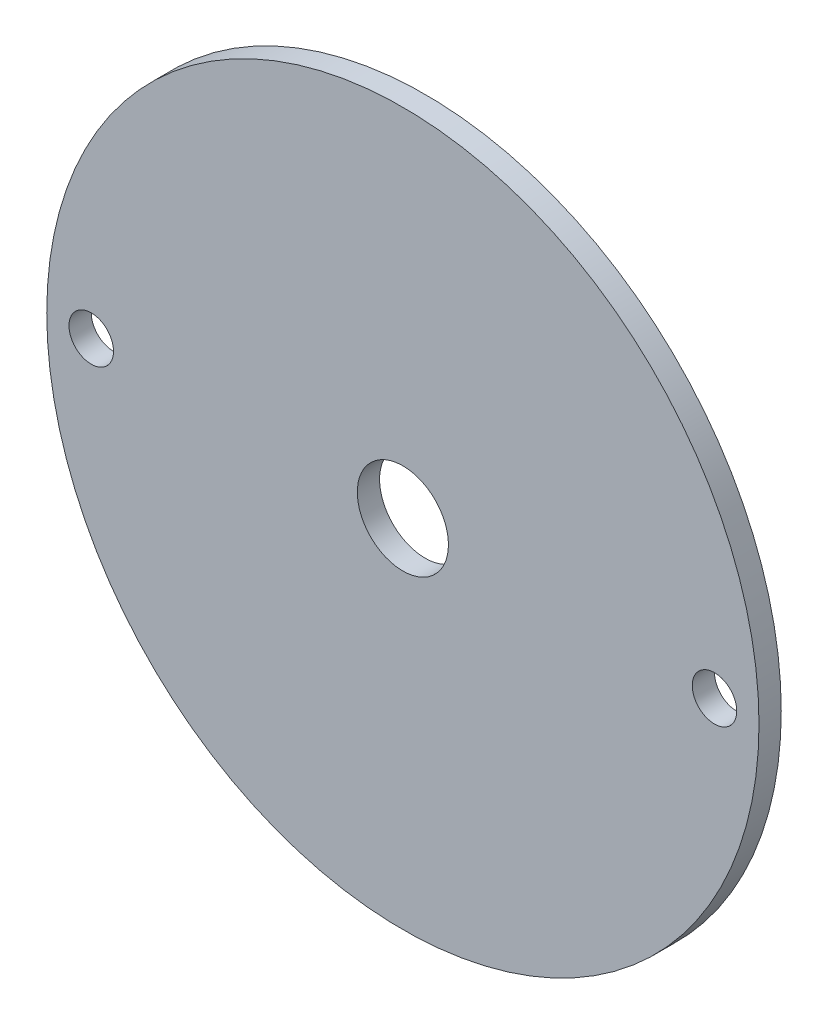
ISO-10303-21;
HEADER;
FILE_DESCRIPTION(('STEP AP214'),'2;1');
FILE_NAME('part.step','',(''),(''),'','','');
FILE_SCHEMA(('AUTOMOTIVE_DESIGN { 1 0 10303 214 1 1 1 1 }'));
ENDSEC;
DATA;
#1=APPLICATION_CONTEXT('core data for automotive mechanical design processes');
#2=APPLICATION_PROTOCOL_DEFINITION('international standard','automotive_design',2000,#1);
#3=PRODUCT_CONTEXT('',#1,'mechanical');
#4=PRODUCT('Part','Part','',(#3));
#5=PRODUCT_RELATED_PRODUCT_CATEGORY('part','',(#4));
#6=PRODUCT_DEFINITION_FORMATION('','',#4);
#7=PRODUCT_DEFINITION_CONTEXT('part definition',#1,'design');
#8=PRODUCT_DEFINITION('design','',#6,#7);
#9=PRODUCT_DEFINITION_SHAPE('','',#8);
#10=(LENGTH_UNIT() NAMED_UNIT(*) SI_UNIT(.MILLI.,.METRE.));
#11=(NAMED_UNIT(*) PLANE_ANGLE_UNIT() SI_UNIT($,.RADIAN.));
#12=(NAMED_UNIT(*) SI_UNIT($,.STERADIAN.) SOLID_ANGLE_UNIT());
#13=UNCERTAINTY_MEASURE_WITH_UNIT(LENGTH_MEASURE(1.E-05),#10,'distance_accuracy_value','');
#14=(GEOMETRIC_REPRESENTATION_CONTEXT(3) GLOBAL_UNCERTAINTY_ASSIGNED_CONTEXT((#13)) GLOBAL_UNIT_ASSIGNED_CONTEXT((#10,
#11,#12)) REPRESENTATION_CONTEXT('',''));
#15=CARTESIAN_POINT('',(0.,0.,0.));
#16=DIRECTION('',(0.,0.,1.));
#17=DIRECTION('',(1.,0.,0.));
#18=AXIS2_PLACEMENT_3D('',#15,#16,#17);
#19=CARTESIAN_POINT('',(0.,0.,3.175));
#20=DIRECTION('',(0.,0.,1.));
#21=DIRECTION('',(1.,0.,0.));
#22=AXIS2_PLACEMENT_3D('',#19,#20,#21);
#23=PLANE('',#22);
#24=CARTESIAN_POINT('',(-44.45,0.,3.175));
#25=DIRECTION('',(0.,0.,1.));
#26=DIRECTION('',(1.,0.,0.));
#27=AXIS2_PLACEMENT_3D('',#24,#25,#26);
#28=CIRCLE('',#27,3.175);
#29=CARTESIAN_POINT('',(-41.275,0.,3.175));
#30=VERTEX_POINT('',#29);
#31=EDGE_CURVE('E49',#30,#30,#28,.T.);
#32=ORIENTED_EDGE('',*,*,#31,.F.);
#33=EDGE_LOOP('',(#32));
#34=FACE_BOUND('',#33,.T.);
#35=CARTESIAN_POINT('',(0.,0.,3.175));
#36=DIRECTION('',(0.,0.,1.));
#37=DIRECTION('',(1.,0.,0.));
#38=AXIS2_PLACEMENT_3D('',#35,#36,#37);
#39=CIRCLE('',#38,50.8);
#40=CARTESIAN_POINT('',(50.8,0.,3.175));
#41=VERTEX_POINT('',#40);
#42=EDGE_CURVE('E10',#41,#41,#39,.T.);
#43=ORIENTED_EDGE('',*,*,#42,.T.);
#44=EDGE_LOOP('',(#43));
#45=FACE_BOUND('',#44,.T.);
#46=CARTESIAN_POINT('',(44.45,0.,3.175));
#47=DIRECTION('',(0.,0.,1.));
#48=DIRECTION('',(1.,0.,0.));
#49=AXIS2_PLACEMENT_3D('',#46,#47,#48);
#50=CIRCLE('',#49,3.175);
#51=CARTESIAN_POINT('',(47.625,0.,3.175));
#52=VERTEX_POINT('',#51);
#53=EDGE_CURVE('E44',#52,#52,#50,.T.);
#54=ORIENTED_EDGE('',*,*,#53,.F.);
#55=EDGE_LOOP('',(#54));
#56=FACE_BOUND('',#55,.T.);
#57=CARTESIAN_POINT('',(0.,0.,3.175));
#58=DIRECTION('',(0.,0.,1.));
#59=DIRECTION('',(1.,0.,0.));
#60=AXIS2_PLACEMENT_3D('',#57,#58,#59);
#61=CIRCLE('',#60,6.5);
#62=CARTESIAN_POINT('',(6.5,0.,3.175));
#63=VERTEX_POINT('',#62);
#64=EDGE_CURVE('E55',#63,#63,#61,.T.);
#65=ORIENTED_EDGE('',*,*,#64,.F.);
#66=EDGE_LOOP('',(#65));
#67=FACE_BOUND('',#66,.T.);
#68=ADVANCED_FACE('F33',(#34,#45,#56,#67),#23,.T.);
#69=CARTESIAN_POINT('',(0.,0.,0.));
#70=DIRECTION('',(0.,0.,1.));
#71=DIRECTION('',(1.,0.,0.));
#72=AXIS2_PLACEMENT_3D('',#69,#70,#71);
#73=PLANE('',#72);
#74=CARTESIAN_POINT('',(0.,0.,0.));
#75=DIRECTION('',(0.,0.,1.));
#76=DIRECTION('',(1.,0.,0.));
#77=AXIS2_PLACEMENT_3D('',#74,#75,#76);
#78=CIRCLE('',#77,50.8);
#79=CARTESIAN_POINT('',(50.8,0.,0.));
#80=VERTEX_POINT('',#79);
#81=EDGE_CURVE('E37',#80,#80,#78,.T.);
#82=ORIENTED_EDGE('',*,*,#81,.F.);
#83=EDGE_LOOP('',(#82));
#84=FACE_BOUND('',#83,.T.);
#85=CARTESIAN_POINT('',(44.45,0.,0.));
#86=DIRECTION('',(0.,0.,1.));
#87=DIRECTION('',(1.,0.,0.));
#88=AXIS2_PLACEMENT_3D('',#85,#86,#87);
#89=CIRCLE('',#88,3.175);
#90=CARTESIAN_POINT('',(47.625,0.,0.));
#91=VERTEX_POINT('',#90);
#92=EDGE_CURVE('E46',#91,#91,#89,.T.);
#93=ORIENTED_EDGE('',*,*,#92,.T.);
#94=EDGE_LOOP('',(#93));
#95=FACE_BOUND('',#94,.T.);
#96=CARTESIAN_POINT('',(-44.45,0.,0.));
#97=DIRECTION('',(0.,0.,1.));
#98=DIRECTION('',(1.,0.,0.));
#99=AXIS2_PLACEMENT_3D('',#96,#97,#98);
#100=CIRCLE('',#99,3.175);
#101=CARTESIAN_POINT('',(-41.275,0.,0.));
#102=VERTEX_POINT('',#101);
#103=EDGE_CURVE('E52',#102,#102,#100,.T.);
#104=ORIENTED_EDGE('',*,*,#103,.T.);
#105=EDGE_LOOP('',(#104));
#106=FACE_BOUND('',#105,.T.);
#107=CARTESIAN_POINT('',(0.,0.,0.));
#108=DIRECTION('',(0.,0.,1.));
#109=DIRECTION('',(1.,0.,0.));
#110=AXIS2_PLACEMENT_3D('',#107,#108,#109);
#111=CIRCLE('',#110,6.5);
#112=CARTESIAN_POINT('',(6.5,0.,0.));
#113=VERTEX_POINT('',#112);
#114=EDGE_CURVE('E58',#113,#113,#111,.T.);
#115=ORIENTED_EDGE('',*,*,#114,.T.);
#116=EDGE_LOOP('',(#115));
#117=FACE_BOUND('',#116,.T.);
#118=ADVANCED_FACE('F68',(#84,#95,#106,#117),#73,.F.);
#119=CARTESIAN_POINT('',(0.,0.,3.175));
#120=DIRECTION('',(0.,0.,-1.));
#121=DIRECTION('',(-1.,0.,0.));
#122=AXIS2_PLACEMENT_3D('',#119,#120,#121);
#123=CYLINDRICAL_SURFACE('',#122,50.8);
#124=ORIENTED_EDGE('',*,*,#42,.F.);
#125=EDGE_LOOP('',(#124));
#126=FACE_BOUND('',#125,.T.);
#127=ORIENTED_EDGE('',*,*,#81,.T.);
#128=EDGE_LOOP('',(#127));
#129=FACE_BOUND('',#128,.T.);
#130=ADVANCED_FACE('F35',(#126,#129),#123,.T.);
#131=CARTESIAN_POINT('',(44.45,0.,3.175));
#132=DIRECTION('',(0.,0.,-1.));
#133=DIRECTION('',(-1.,0.,0.));
#134=AXIS2_PLACEMENT_3D('',#131,#132,#133);
#135=CYLINDRICAL_SURFACE('',#134,3.175);
#136=ORIENTED_EDGE('',*,*,#53,.T.);
#137=EDGE_LOOP('',(#136));
#138=FACE_BOUND('',#137,.T.);
#139=ORIENTED_EDGE('',*,*,#92,.F.);
#140=EDGE_LOOP('',(#139));
#141=FACE_BOUND('',#140,.T.);
#142=ADVANCED_FACE('F77',(#138,#141),#135,.F.);
#143=CARTESIAN_POINT('',(-44.45,0.,3.175));
#144=DIRECTION('',(0.,0.,-1.));
#145=DIRECTION('',(-1.,0.,0.));
#146=AXIS2_PLACEMENT_3D('',#143,#144,#145);
#147=CYLINDRICAL_SURFACE('',#146,3.175);
#148=ORIENTED_EDGE('',*,*,#31,.T.);
#149=EDGE_LOOP('',(#148));
#150=FACE_BOUND('',#149,.T.);
#151=ORIENTED_EDGE('',*,*,#103,.F.);
#152=EDGE_LOOP('',(#151));
#153=FACE_BOUND('',#152,.T.);
#154=ADVANCED_FACE('F80',(#150,#153),#147,.F.);
#155=CARTESIAN_POINT('',(0.,0.,3.175));
#156=DIRECTION('',(0.,0.,-1.));
#157=DIRECTION('',(-1.,0.,0.));
#158=AXIS2_PLACEMENT_3D('',#155,#156,#157);
#159=CYLINDRICAL_SURFACE('',#158,6.5);
#160=ORIENTED_EDGE('',*,*,#64,.T.);
#161=EDGE_LOOP('',(#160));
#162=FACE_BOUND('',#161,.T.);
#163=ORIENTED_EDGE('',*,*,#114,.F.);
#164=EDGE_LOOP('',(#163));
#165=FACE_BOUND('',#164,.T.);
#166=ADVANCED_FACE('F64',(#162,#165),#159,.F.);
#167=CLOSED_SHELL('',(#68,#118,#130,#142,#154,#166));
#168=MANIFOLD_SOLID_BREP('B2',#167);
#169=ADVANCED_BREP_SHAPE_REPRESENTATION('',(#18,#168),#14);
#170=SHAPE_DEFINITION_REPRESENTATION(#9,#169);
ENDSEC;
END-ISO-10303-21;
